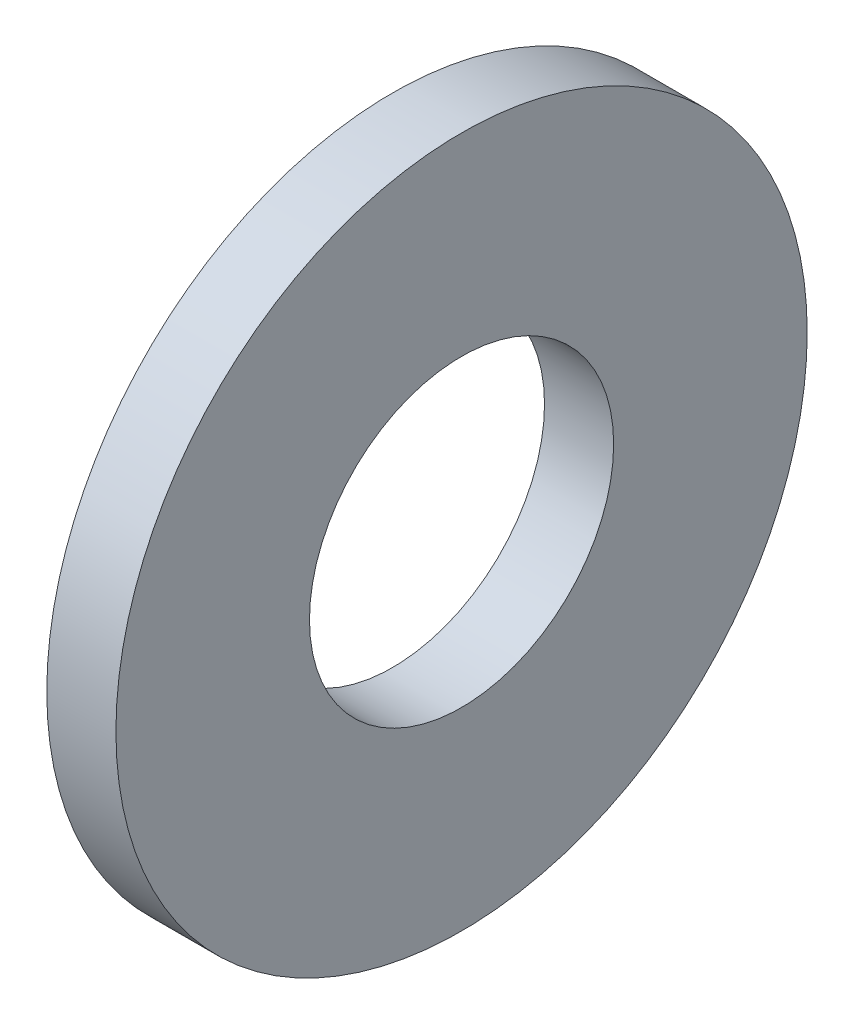
ISO-10303-21;
HEADER;
FILE_DESCRIPTION(('STEP AP214'),'2;1');
FILE_NAME('part.step','',(''),(''),'','','');
FILE_SCHEMA(('AUTOMOTIVE_DESIGN { 1 0 10303 214 1 1 1 1 }'));
ENDSEC;
DATA;
#1=APPLICATION_CONTEXT('core data for automotive mechanical design processes');
#2=APPLICATION_PROTOCOL_DEFINITION('international standard','automotive_design',2000,#1);
#3=PRODUCT_CONTEXT('',#1,'mechanical');
#4=PRODUCT('Part','Part','',(#3));
#5=PRODUCT_RELATED_PRODUCT_CATEGORY('part','',(#4));
#6=PRODUCT_DEFINITION_FORMATION('','',#4);
#7=PRODUCT_DEFINITION_CONTEXT('part definition',#1,'design');
#8=PRODUCT_DEFINITION('design','',#6,#7);
#9=PRODUCT_DEFINITION_SHAPE('','',#8);
#10=(LENGTH_UNIT() NAMED_UNIT(*) SI_UNIT(.MILLI.,.METRE.));
#11=(NAMED_UNIT(*) PLANE_ANGLE_UNIT() SI_UNIT($,.RADIAN.));
#12=(NAMED_UNIT(*) SI_UNIT($,.STERADIAN.) SOLID_ANGLE_UNIT());
#13=UNCERTAINTY_MEASURE_WITH_UNIT(LENGTH_MEASURE(1.E-05),#10,'distance_accuracy_value','');
#14=(GEOMETRIC_REPRESENTATION_CONTEXT(3) GLOBAL_UNCERTAINTY_ASSIGNED_CONTEXT((#13)) GLOBAL_UNIT_ASSIGNED_CONTEXT((#10,
#11,#12)) REPRESENTATION_CONTEXT('',''));
#15=CARTESIAN_POINT('',(0.,0.,0.));
#16=DIRECTION('',(0.,0.,1.));
#17=DIRECTION('',(1.,0.,0.));
#18=AXIS2_PLACEMENT_3D('',#15,#16,#17);
#19=CARTESIAN_POINT('',(2.,0.,0.));
#20=DIRECTION('',(1.,0.,0.));
#21=DIRECTION('',(0.,0.,-1.));
#22=AXIS2_PLACEMENT_3D('',#19,#20,#21);
#23=PLANE('',#22);
#24=CARTESIAN_POINT('',(2.,0.,0.));
#25=DIRECTION('',(1.,0.,0.));
#26=DIRECTION('',(0.,0.,-1.));
#27=AXIS2_PLACEMENT_3D('',#24,#25,#26);
#28=CIRCLE('',#27,10.);
#29=CARTESIAN_POINT('',(2.,0.,-10.));
#30=VERTEX_POINT('',#29);
#31=EDGE_CURVE('E10',#30,#30,#28,.T.);
#32=ORIENTED_EDGE('',*,*,#31,.T.);
#33=EDGE_LOOP('',(#32));
#34=FACE_BOUND('',#33,.T.);
#35=CARTESIAN_POINT('',(2.,0.,0.));
#36=DIRECTION('',(1.,0.,0.));
#37=DIRECTION('',(0.,0.,-1.));
#38=AXIS2_PLACEMENT_3D('',#35,#36,#37);
#39=CIRCLE('',#38,4.4);
#40=CARTESIAN_POINT('',(2.,0.,-4.4));
#41=VERTEX_POINT('',#40);
#42=EDGE_CURVE('E55',#41,#41,#39,.T.);
#43=ORIENTED_EDGE('',*,*,#42,.F.);
#44=EDGE_LOOP('',(#43));
#45=FACE_BOUND('',#44,.T.);
#46=ADVANCED_FACE('F41',(#34,#45),#23,.T.);
#47=CARTESIAN_POINT('',(0.,0.,0.));
#48=DIRECTION('',(1.,0.,0.));
#49=DIRECTION('',(0.,0.,-1.));
#50=AXIS2_PLACEMENT_3D('',#47,#48,#49);
#51=PLANE('',#50);
#52=CARTESIAN_POINT('',(0.,0.,0.));
#53=DIRECTION('',(1.,0.,0.));
#54=DIRECTION('',(0.,0.,-1.));
#55=AXIS2_PLACEMENT_3D('',#52,#53,#54);
#56=CIRCLE('',#55,10.);
#57=CARTESIAN_POINT('',(0.,0.,-10.));
#58=VERTEX_POINT('',#57);
#59=EDGE_CURVE('E45',#58,#58,#56,.T.);
#60=ORIENTED_EDGE('',*,*,#59,.F.);
#61=EDGE_LOOP('',(#60));
#62=FACE_BOUND('',#61,.T.);
#63=CARTESIAN_POINT('',(0.,0.,0.));
#64=DIRECTION('',(1.,0.,0.));
#65=DIRECTION('',(0.,0.,-1.));
#66=AXIS2_PLACEMENT_3D('',#63,#64,#65);
#67=CIRCLE('',#66,4.4);
#68=CARTESIAN_POINT('',(0.,0.,-4.4));
#69=VERTEX_POINT('',#68);
#70=EDGE_CURVE('E57',#69,#69,#67,.T.);
#71=ORIENTED_EDGE('',*,*,#70,.T.);
#72=EDGE_LOOP('',(#71));
#73=FACE_BOUND('',#72,.T.);
#74=ADVANCED_FACE('F70',(#62,#73),#51,.F.);
#75=CARTESIAN_POINT('',(2.,0.,0.));
#76=DIRECTION('',(-1.,0.,0.));
#77=DIRECTION('',(0.,0.,1.));
#78=AXIS2_PLACEMENT_3D('',#75,#76,#77);
#79=CYLINDRICAL_SURFACE('',#78,10.);
#80=ORIENTED_EDGE('',*,*,#31,.F.);
#81=EDGE_LOOP('',(#80));
#82=FACE_BOUND('',#81,.T.);
#83=ORIENTED_EDGE('',*,*,#59,.T.);
#84=EDGE_LOOP('',(#83));
#85=FACE_BOUND('',#84,.T.);
#86=ADVANCED_FACE('F43',(#82,#85),#79,.T.);
#87=CARTESIAN_POINT('',(2.,0.,0.));
#88=DIRECTION('',(-1.,0.,0.));
#89=DIRECTION('',(0.,0.,1.));
#90=AXIS2_PLACEMENT_3D('',#87,#88,#89);
#91=CYLINDRICAL_SURFACE('',#90,4.4);
#92=ORIENTED_EDGE('',*,*,#42,.T.);
#93=EDGE_LOOP('',(#92));
#94=FACE_BOUND('',#93,.T.);
#95=ORIENTED_EDGE('',*,*,#70,.F.);
#96=EDGE_LOOP('',(#95));
#97=FACE_BOUND('',#96,.T.);
#98=ADVANCED_FACE('F66',(#94,#97),#91,.F.);
#99=CLOSED_SHELL('',(#46,#74,#86,#98));
#100=MANIFOLD_SOLID_BREP('B2',#99);
#101=ADVANCED_BREP_SHAPE_REPRESENTATION('',(#18,#100),#14);
#102=SHAPE_DEFINITION_REPRESENTATION(#9,#101);
ENDSEC;
END-ISO-10303-21;
